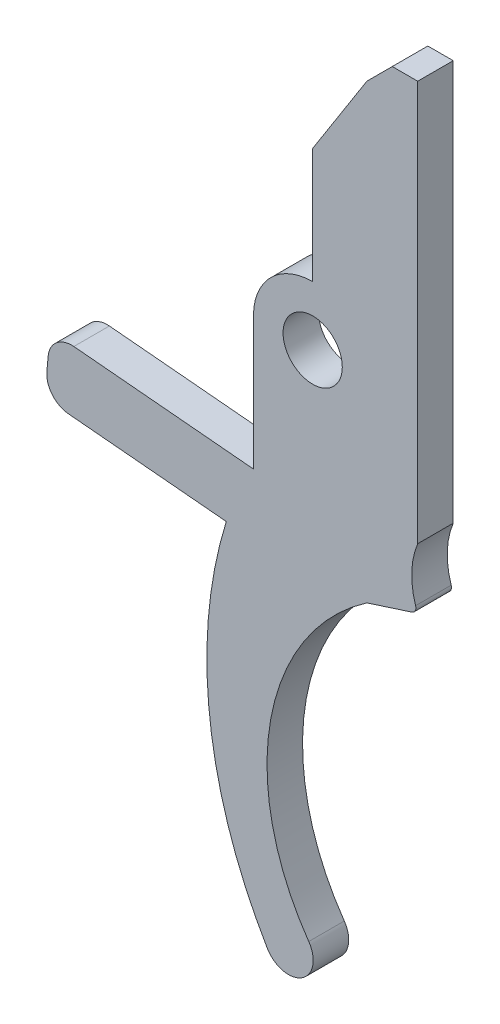
ISO-10303-21;
HEADER;
FILE_DESCRIPTION(('STEP AP214'),'2;1');
FILE_NAME('part.step','',(''),(''),'','','');
FILE_SCHEMA(('AUTOMOTIVE_DESIGN { 1 0 10303 214 1 1 1 1 }'));
ENDSEC;
DATA;
#1=APPLICATION_CONTEXT('core data for automotive mechanical design processes');
#2=APPLICATION_PROTOCOL_DEFINITION('international standard','automotive_design',2000,#1);
#3=PRODUCT_CONTEXT('',#1,'mechanical');
#4=PRODUCT('Part','Part','',(#3));
#5=PRODUCT_RELATED_PRODUCT_CATEGORY('part','',(#4));
#6=PRODUCT_DEFINITION_FORMATION('','',#4);
#7=PRODUCT_DEFINITION_CONTEXT('part definition',#1,'design');
#8=PRODUCT_DEFINITION('design','',#6,#7);
#9=PRODUCT_DEFINITION_SHAPE('','',#8);
#10=(LENGTH_UNIT() NAMED_UNIT(*) SI_UNIT(.MILLI.,.METRE.));
#11=(NAMED_UNIT(*) PLANE_ANGLE_UNIT() SI_UNIT($,.RADIAN.));
#12=(NAMED_UNIT(*) SI_UNIT($,.STERADIAN.) SOLID_ANGLE_UNIT());
#13=UNCERTAINTY_MEASURE_WITH_UNIT(LENGTH_MEASURE(1.E-05),#10,'distance_accuracy_value','');
#14=(GEOMETRIC_REPRESENTATION_CONTEXT(3) GLOBAL_UNCERTAINTY_ASSIGNED_CONTEXT((#13)) GLOBAL_UNIT_ASSIGNED_CONTEXT((#10,
#11,#12)) REPRESENTATION_CONTEXT('',''));
#15=CARTESIAN_POINT('',(0.,0.,0.));
#16=DIRECTION('',(0.,0.,1.));
#17=DIRECTION('',(1.,0.,0.));
#18=AXIS2_PLACEMENT_3D('',#15,#16,#17);
#19=CARTESIAN_POINT('',(8.86641034320296,0.,3.));
#20=DIRECTION('',(1.,0.,0.));
#21=DIRECTION('',(0.,1.,0.));
#22=AXIS2_PLACEMENT_3D('',#19,#20,#21);
#23=PLANE('',#22);
#24=DIRECTION('',(0.,-1.,0.));
#25=VECTOR('',#24,1.);
#26=CARTESIAN_POINT('',(8.86641034320296,0.,0.));
#27=LINE('',#26,#25);
#28=CARTESIAN_POINT('',(8.86641034320296,24.0890947898825,0.));
#29=VERTEX_POINT('',#28);
#30=CARTESIAN_POINT('',(8.86641034320296,-9.72823685462297,0.));
#31=VERTEX_POINT('',#30);
#32=EDGE_CURVE('E191',#29,#31,#27,.T.);
#33=ORIENTED_EDGE('',*,*,#32,.F.);
#34=DIRECTION('',(0.,0.,-1.));
#35=VECTOR('',#34,1.);
#36=CARTESIAN_POINT('',(8.86641034320296,24.0890947898825,3.));
#37=LINE('',#36,#35);
#38=CARTESIAN_POINT('',(8.86641034320296,24.0890947898825,3.));
#39=VERTEX_POINT('',#38);
#40=EDGE_CURVE('E11',#39,#29,#37,.T.);
#41=ORIENTED_EDGE('',*,*,#40,.F.);
#42=DIRECTION('',(0.,-1.,0.));
#43=VECTOR('',#42,1.);
#44=CARTESIAN_POINT('',(8.86641034320296,0.,3.));
#45=LINE('',#44,#43);
#46=CARTESIAN_POINT('',(8.86641034320296,-9.72823685462297,3.));
#47=VERTEX_POINT('',#46);
#48=EDGE_CURVE('E233',#39,#47,#45,.T.);
#49=ORIENTED_EDGE('',*,*,#48,.T.);
#50=DIRECTION('',(0.,0.,-1.));
#51=VECTOR('',#50,1.);
#52=CARTESIAN_POINT('',(8.86641034320296,-9.72823685462297,3.));
#53=LINE('',#52,#51);
#54=EDGE_CURVE('E51',#47,#31,#53,.T.);
#55=ORIENTED_EDGE('',*,*,#54,.T.);
#56=EDGE_LOOP('',(#33,#41,#49,#55));
#57=FACE_BOUND('',#56,.T.);
#58=ADVANCED_FACE('F35',(#57),#23,.T.);
#59=CARTESIAN_POINT('',(0.,24.0890947898825,3.));
#60=DIRECTION('',(0.,1.,0.));
#61=DIRECTION('',(0.,0.,1.));
#62=AXIS2_PLACEMENT_3D('',#59,#60,#61);
#63=PLANE('',#62);
#64=DIRECTION('',(1.,0.,0.));
#65=VECTOR('',#64,1.);
#66=CARTESIAN_POINT('',(0.,24.0890947898825,0.));
#67=LINE('',#66,#65);
#68=CARTESIAN_POINT('',(6.7207045833283,24.0890947898825,0.));
#69=VERTEX_POINT('',#68);
#70=EDGE_CURVE('E193',#69,#29,#67,.T.);
#71=ORIENTED_EDGE('',*,*,#70,.F.);
#72=DIRECTION('',(0.,0.,-1.));
#73=VECTOR('',#72,1.);
#74=CARTESIAN_POINT('',(6.7207045833283,24.0890947898825,3.));
#75=LINE('',#74,#73);
#76=CARTESIAN_POINT('',(6.7207045833283,24.0890947898825,3.));
#77=VERTEX_POINT('',#76);
#78=EDGE_CURVE('E43',#77,#69,#75,.T.);
#79=ORIENTED_EDGE('',*,*,#78,.F.);
#80=DIRECTION('',(1.,0.,0.));
#81=VECTOR('',#80,1.);
#82=CARTESIAN_POINT('',(0.,24.0890947898825,3.));
#83=LINE('',#82,#81);
#84=EDGE_CURVE('E287',#77,#39,#83,.T.);
#85=ORIENTED_EDGE('',*,*,#84,.T.);
#86=ORIENTED_EDGE('',*,*,#40,.T.);
#87=EDGE_LOOP('',(#71,#79,#85,#86));
#88=FACE_BOUND('',#87,.T.);
#89=ADVANCED_FACE('F286',(#88),#63,.T.);
#90=CARTESIAN_POINT('',(-8.68419510327712,8.68419510327721,3.));
#91=DIRECTION('',(0.707106781186544,-0.707106781186551,0.));
#92=DIRECTION('',(0.707106781186551,0.707106781186544,0.));
#93=AXIS2_PLACEMENT_3D('',#90,#91,#92);
#94=PLANE('',#93);
#95=DIRECTION('',(-0.707106781186551,-0.707106781186544,0.));
#96=VECTOR('',#95,1.);
#97=CARTESIAN_POINT('',(-8.68419510327712,8.68419510327721,0.));
#98=LINE('',#97,#96);
#99=CARTESIAN_POINT('',(4.57499882345365,21.9433890300078,0.));
#100=VERTEX_POINT('',#99);
#101=EDGE_CURVE('E196',#69,#100,#98,.T.);
#102=ORIENTED_EDGE('',*,*,#101,.T.);
#103=DIRECTION('',(0.,0.,-1.));
#104=VECTOR('',#103,1.);
#105=CARTESIAN_POINT('',(4.57499882345365,21.9433890300078,3.));
#106=LINE('',#105,#104);
#107=CARTESIAN_POINT('',(4.57499882345365,21.9433890300078,3.));
#108=VERTEX_POINT('',#107);
#109=EDGE_CURVE('E269',#108,#100,#106,.T.);
#110=ORIENTED_EDGE('',*,*,#109,.F.);
#111=DIRECTION('',(-0.707106781186551,-0.707106781186544,0.));
#112=VECTOR('',#111,1.);
#113=CARTESIAN_POINT('',(-8.68419510327712,8.68419510327721,3.));
#114=LINE('',#113,#112);
#115=EDGE_CURVE('E276',#77,#108,#114,.T.);
#116=ORIENTED_EDGE('',*,*,#115,.F.);
#117=ORIENTED_EDGE('',*,*,#78,.T.);
#118=EDGE_LOOP('',(#102,#110,#116,#117));
#119=FACE_BOUND('',#118,.T.);
#120=ADVANCED_FACE('F274',(#119),#94,.F.);
#121=CARTESIAN_POINT('',(-6.67347195424029,4.24029597773582,3.));
#122=DIRECTION('',(0.84403129205972,-0.53629392875922,0.));
#123=DIRECTION('',(0.53629392875922,0.84403129205972,0.));
#124=AXIS2_PLACEMENT_3D('',#121,#122,#123);
#125=PLANE('',#124);
#126=DIRECTION('',(-0.53629392875922,-0.84403129205972,0.));
#127=VECTOR('',#126,1.);
#128=CARTESIAN_POINT('',(-6.67347195424029,4.24029597773582,0.));
#129=LINE('',#128,#127);
#130=CARTESIAN_POINT('',(0.,14.7431543059915,0.));
#131=VERTEX_POINT('',#130);
#132=EDGE_CURVE('E198',#100,#131,#129,.T.);
#133=ORIENTED_EDGE('',*,*,#132,.T.);
#134=DIRECTION('',(0.,0.,-1.));
#135=VECTOR('',#134,1.);
#136=CARTESIAN_POINT('',(0.,14.7431543059915,3.));
#137=LINE('',#136,#135);
#138=CARTESIAN_POINT('',(0.,14.7431543059915,3.));
#139=VERTEX_POINT('',#138);
#140=EDGE_CURVE('E266',#139,#131,#137,.T.);
#141=ORIENTED_EDGE('',*,*,#140,.F.);
#142=DIRECTION('',(-0.53629392875922,-0.84403129205972,0.));
#143=VECTOR('',#142,1.);
#144=CARTESIAN_POINT('',(-6.67347195424029,4.24029597773582,3.));
#145=LINE('',#144,#143);
#146=EDGE_CURVE('E547',#108,#139,#145,.T.);
#147=ORIENTED_EDGE('',*,*,#146,.F.);
#148=ORIENTED_EDGE('',*,*,#109,.T.);
#149=EDGE_LOOP('',(#133,#141,#147,#148));
#150=FACE_BOUND('',#149,.T.);
#151=ADVANCED_FACE('F306',(#150),#125,.F.);
#152=CARTESIAN_POINT('',(0.,0.,3.));
#153=DIRECTION('',(1.,0.,0.));
#154=DIRECTION('',(0.,0.,-1.));
#155=AXIS2_PLACEMENT_3D('',#152,#153,#154);
#156=PLANE('',#155);
#157=DIRECTION('',(0.,-1.,0.));
#158=VECTOR('',#157,1.);
#159=CARTESIAN_POINT('',(0.,0.,0.));
#160=LINE('',#159,#158);
#161=CARTESIAN_POINT('',(0.,5.,0.));
#162=VERTEX_POINT('',#161);
#163=EDGE_CURVE('E200',#131,#162,#160,.T.);
#164=ORIENTED_EDGE('',*,*,#163,.T.);
#165=DIRECTION('',(0.,0.,-1.));
#166=VECTOR('',#165,1.);
#167=CARTESIAN_POINT('',(0.,5.,3.));
#168=LINE('',#167,#166);
#169=CARTESIAN_POINT('',(0.,5.,3.));
#170=VERTEX_POINT('',#169);
#171=EDGE_CURVE('E263',#170,#162,#168,.T.);
#172=ORIENTED_EDGE('',*,*,#171,.F.);
#173=DIRECTION('',(0.,-1.,0.));
#174=VECTOR('',#173,1.);
#175=CARTESIAN_POINT('',(0.,0.,3.));
#176=LINE('',#175,#174);
#177=EDGE_CURVE('E545',#139,#170,#176,.T.);
#178=ORIENTED_EDGE('',*,*,#177,.F.);
#179=ORIENTED_EDGE('',*,*,#140,.T.);
#180=EDGE_LOOP('',(#164,#172,#178,#179));
#181=FACE_BOUND('',#180,.T.);
#182=ADVANCED_FACE('F311',(#181),#156,.F.);
#183=CARTESIAN_POINT('',(0.,0.,3.));
#184=DIRECTION('',(0.,0.,-1.));
#185=DIRECTION('',(-1.,0.,0.));
#186=AXIS2_PLACEMENT_3D('',#183,#184,#185);
#187=CYLINDRICAL_SURFACE('',#186,5.);
#188=CARTESIAN_POINT('',(0.,0.,0.));
#189=DIRECTION('',(0.,0.,1.));
#190=DIRECTION('',(1.,0.,0.));
#191=AXIS2_PLACEMENT_3D('',#188,#189,#190);
#192=CIRCLE('',#191,5.);
#193=CARTESIAN_POINT('',(-5.,0.,0.));
#194=VERTEX_POINT('',#193);
#195=EDGE_CURVE('E202',#162,#194,#192,.T.);
#196=ORIENTED_EDGE('',*,*,#195,.T.);
#197=DIRECTION('',(0.,0.,-1.));
#198=VECTOR('',#197,1.);
#199=CARTESIAN_POINT('',(-5.,0.,3.));
#200=LINE('',#199,#198);
#201=CARTESIAN_POINT('',(-5.,0.,3.));
#202=VERTEX_POINT('',#201);
#203=EDGE_CURVE('E260',#202,#194,#200,.T.);
#204=ORIENTED_EDGE('',*,*,#203,.F.);
#205=CARTESIAN_POINT('',(0.,0.,3.));
#206=DIRECTION('',(0.,0.,1.));
#207=DIRECTION('',(1.,0.,0.));
#208=AXIS2_PLACEMENT_3D('',#205,#206,#207);
#209=CIRCLE('',#208,5.);
#210=EDGE_CURVE('E541',#170,#202,#209,.T.);
#211=ORIENTED_EDGE('',*,*,#210,.F.);
#212=ORIENTED_EDGE('',*,*,#171,.T.);
#213=EDGE_LOOP('',(#196,#204,#211,#212));
#214=FACE_BOUND('',#213,.T.);
#215=ADVANCED_FACE('F315',(#214),#187,.T.);
#216=CARTESIAN_POINT('',(-5.,0.,3.));
#217=DIRECTION('',(1.,0.,0.));
#218=DIRECTION('',(0.,0.,-1.));
#219=AXIS2_PLACEMENT_3D('',#216,#217,#218);
#220=PLANE('',#219);
#221=DIRECTION('',(0.,-1.,0.));
#222=VECTOR('',#221,1.);
#223=CARTESIAN_POINT('',(-5.,0.,0.));
#224=LINE('',#223,#222);
#225=CARTESIAN_POINT('',(-5.,-11.2022730729682,0.));
#226=VERTEX_POINT('',#225);
#227=EDGE_CURVE('E204',#194,#226,#224,.T.);
#228=ORIENTED_EDGE('',*,*,#227,.T.);
#229=DIRECTION('',(0.,0.,-1.));
#230=VECTOR('',#229,1.);
#231=CARTESIAN_POINT('',(-5.,-11.2022730729682,3.));
#232=LINE('',#231,#230);
#233=CARTESIAN_POINT('',(-5.,-11.2022730729682,3.));
#234=VERTEX_POINT('',#233);
#235=EDGE_CURVE('E257',#234,#226,#232,.T.);
#236=ORIENTED_EDGE('',*,*,#235,.F.);
#237=DIRECTION('',(0.,-1.,0.));
#238=VECTOR('',#237,1.);
#239=CARTESIAN_POINT('',(-5.,0.,3.));
#240=LINE('',#239,#238);
#241=EDGE_CURVE('E538',#202,#234,#240,.T.);
#242=ORIENTED_EDGE('',*,*,#241,.F.);
#243=ORIENTED_EDGE('',*,*,#203,.T.);
#244=EDGE_LOOP('',(#228,#236,#242,#243));
#245=FACE_BOUND('',#244,.T.);
#246=ADVANCED_FACE('F319',(#245),#220,.F.);
#247=CARTESIAN_POINT('',(-1.05178514284933,-11.5614556745727,3.));
#248=DIRECTION('',(-0.0905992835595561,-0.995887428286197,0.));
#249=DIRECTION('',(0.995887428286197,-0.0905992835595561,0.));
#250=AXIS2_PLACEMENT_3D('',#247,#248,#249);
#251=PLANE('',#250);
#252=DIRECTION('',(-0.995887428286197,0.0905992835595561,0.));
#253=VECTOR('',#252,1.);
#254=CARTESIAN_POINT('',(-1.05178514284933,-11.5614556745727,0.));
#255=LINE('',#254,#253);
#256=CARTESIAN_POINT('',(-20.1624606171726,-9.82289220129703,0.));
#257=VERTEX_POINT('',#256);
#258=EDGE_CURVE('E206',#226,#257,#255,.T.);
#259=ORIENTED_EDGE('',*,*,#258,.T.);
#260=DIRECTION('',(0.,0.,-1.));
#261=VECTOR('',#260,1.);
#262=CARTESIAN_POINT('',(-20.1624606171726,-9.82289220129703,3.));
#263=LINE('',#262,#261);
#264=CARTESIAN_POINT('',(-20.1624606171726,-9.82289220129703,3.));
#265=VERTEX_POINT('',#264);
#266=EDGE_CURVE('E254',#265,#257,#263,.T.);
#267=ORIENTED_EDGE('',*,*,#266,.F.);
#268=DIRECTION('',(-0.995887428286197,0.0905992835595561,0.));
#269=VECTOR('',#268,1.);
#270=CARTESIAN_POINT('',(-1.05178514284933,-11.5614556745727,3.));
#271=LINE('',#270,#269);
#272=EDGE_CURVE('E536',#234,#265,#271,.T.);
#273=ORIENTED_EDGE('',*,*,#272,.F.);
#274=ORIENTED_EDGE('',*,*,#235,.T.);
#275=EDGE_LOOP('',(#259,#267,#273,#274));
#276=FACE_BOUND('',#275,.T.);
#277=ADVANCED_FACE('F323',(#276),#251,.F.);
#278=CARTESIAN_POINT('',(-20.3436591842917,-11.8146670578694,3.));
#279=DIRECTION('',(0.,0.,-1.));
#280=DIRECTION('',(-1.,0.,0.));
#281=AXIS2_PLACEMENT_3D('',#278,#279,#280);
#282=CYLINDRICAL_SURFACE('',#281,2.);
#283=CARTESIAN_POINT('',(-20.3436591842917,-11.8146670578694,0.));
#284=DIRECTION('',(0.,0.,1.));
#285=DIRECTION('',(1.,0.,0.));
#286=AXIS2_PLACEMENT_3D('',#283,#284,#285);
#287=CIRCLE('',#286,2.);
#288=CARTESIAN_POINT('',(-22.3354340408641,-11.6334684907503,0.));
#289=VERTEX_POINT('',#288);
#290=EDGE_CURVE('E208',#257,#289,#287,.T.);
#291=ORIENTED_EDGE('',*,*,#290,.T.);
#292=DIRECTION('',(0.,0.,-1.));
#293=VECTOR('',#292,1.);
#294=CARTESIAN_POINT('',(-22.3354340408641,-11.6334684907503,3.));
#295=LINE('',#294,#293);
#296=CARTESIAN_POINT('',(-22.3354340408641,-11.6334684907503,3.));
#297=VERTEX_POINT('',#296);
#298=EDGE_CURVE('E251',#297,#289,#295,.T.);
#299=ORIENTED_EDGE('',*,*,#298,.F.);
#300=CARTESIAN_POINT('',(-20.3436591842917,-11.8146670578694,3.));
#301=DIRECTION('',(0.,0.,1.));
#302=DIRECTION('',(1.,0.,0.));
#303=AXIS2_PLACEMENT_3D('',#300,#301,#302);
#304=CIRCLE('',#303,2.);
#305=EDGE_CURVE('E529',#265,#297,#304,.T.);
#306=ORIENTED_EDGE('',*,*,#305,.F.);
#307=ORIENTED_EDGE('',*,*,#266,.T.);
#308=EDGE_LOOP('',(#291,#299,#306,#307));
#309=FACE_BOUND('',#308,.T.);
#310=ADVANCED_FACE('F327',(#309),#282,.T.);
#311=CARTESIAN_POINT('',(-21.1024503308957,1.91976204039482,3.));
#312=DIRECTION('',(0.995887428286197,-0.0905992835595558,0.));
#313=DIRECTION('',(0.0905992835595558,0.995887428286197,0.));
#314=AXIS2_PLACEMENT_3D('',#311,#312,#313);
#315=PLANE('',#314);
#316=DIRECTION('',(-0.0905992835595558,-0.995887428286197,0.));
#317=VECTOR('',#316,1.);
#318=CARTESIAN_POINT('',(-21.1024503308957,1.91976204039482,0.));
#319=LINE('',#318,#317);
#320=CARTESIAN_POINT('',(-22.4416911387046,-12.8014700879813,0.));
#321=VERTEX_POINT('',#320);
#322=EDGE_CURVE('E210',#289,#321,#319,.T.);
#323=ORIENTED_EDGE('',*,*,#322,.T.);
#324=DIRECTION('',(0.,0.,-1.));
#325=VECTOR('',#324,1.);
#326=CARTESIAN_POINT('',(-22.4416911387046,-12.8014700879813,3.));
#327=LINE('',#326,#325);
#328=CARTESIAN_POINT('',(-22.4416911387046,-12.8014700879813,3.));
#329=VERTEX_POINT('',#328);
#330=EDGE_CURVE('E248',#329,#321,#327,.T.);
#331=ORIENTED_EDGE('',*,*,#330,.F.);
#332=DIRECTION('',(-0.0905992835595558,-0.995887428286197,0.));
#333=VECTOR('',#332,1.);
#334=CARTESIAN_POINT('',(-21.1024503308957,1.91976204039482,3.));
#335=LINE('',#334,#333);
#336=EDGE_CURVE('E526',#297,#329,#335,.T.);
#337=ORIENTED_EDGE('',*,*,#336,.F.);
#338=ORIENTED_EDGE('',*,*,#298,.T.);
#339=EDGE_LOOP('',(#323,#331,#337,#338));
#340=FACE_BOUND('',#339,.T.);
#341=ADVANCED_FACE('F331',(#340),#315,.F.);
#342=CARTESIAN_POINT('',(-20.4499162821322,-12.9826686551004,3.));
#343=DIRECTION('',(0.,0.,-1.));
#344=DIRECTION('',(-1.,0.,0.));
#345=AXIS2_PLACEMENT_3D('',#342,#343,#344);
#346=CYLINDRICAL_SURFACE('',#345,2.);
#347=CARTESIAN_POINT('',(-20.4499162821322,-12.9826686551004,0.));
#348=DIRECTION('',(0.,0.,1.));
#349=DIRECTION('',(1.,0.,0.));
#350=AXIS2_PLACEMENT_3D('',#347,#348,#349);
#351=CIRCLE('',#350,2.);
#352=CARTESIAN_POINT('',(-20.6311148492513,-14.9744435116728,0.));
#353=VERTEX_POINT('',#352);
#354=EDGE_CURVE('E212',#321,#353,#351,.T.);
#355=ORIENTED_EDGE('',*,*,#354,.T.);
#356=DIRECTION('',(0.,0.,-1.));
#357=VECTOR('',#356,1.);
#358=CARTESIAN_POINT('',(-20.6311148492513,-14.9744435116728,3.));
#359=LINE('',#358,#357);
#360=CARTESIAN_POINT('',(-20.6311148492513,-14.9744435116728,3.));
#361=VERTEX_POINT('',#360);
#362=EDGE_CURVE('E245',#361,#353,#359,.T.);
#363=ORIENTED_EDGE('',*,*,#362,.F.);
#364=CARTESIAN_POINT('',(-20.4499162821322,-12.9826686551004,3.));
#365=DIRECTION('',(0.,0.,1.));
#366=DIRECTION('',(1.,0.,0.));
#367=AXIS2_PLACEMENT_3D('',#364,#365,#366);
#368=CIRCLE('',#367,2.);
#369=EDGE_CURVE('E524',#329,#361,#368,.T.);
#370=ORIENTED_EDGE('',*,*,#369,.F.);
#371=ORIENTED_EDGE('',*,*,#330,.T.);
#372=EDGE_LOOP('',(#355,#363,#370,#371));
#373=FACE_BOUND('',#372,.T.);
#374=ADVANCED_FACE('F335',(#373),#346,.T.);
#375=CARTESIAN_POINT('',(-1.52043937492807,-16.7130069849485,3.));
#376=DIRECTION('',(0.0905992835595559,0.995887428286197,0.));
#377=DIRECTION('',(-0.995887428286197,0.090599283559556,0.));
#378=AXIS2_PLACEMENT_3D('',#375,#376,#377);
#379=PLANE('',#378);
#380=DIRECTION('',(0.995887428286197,-0.0905992835595559,0.));
#381=VECTOR('',#380,1.);
#382=CARTESIAN_POINT('',(-1.52043937492807,-16.7130069849485,0.));
#383=LINE('',#382,#381);
#384=CARTESIAN_POINT('',(-7.29313308515625,-16.1878453055251,0.));
#385=VERTEX_POINT('',#384);
#386=EDGE_CURVE('E214',#353,#385,#383,.T.);
#387=ORIENTED_EDGE('',*,*,#386,.T.);
#388=DIRECTION('',(0.,0.,-1.));
#389=VECTOR('',#388,1.);
#390=CARTESIAN_POINT('',(-7.29313308515625,-16.1878453055251,3.));
#391=LINE('',#390,#389);
#392=CARTESIAN_POINT('',(-7.29313308515625,-16.1878453055251,3.));
#393=VERTEX_POINT('',#392);
#394=EDGE_CURVE('E242',#393,#385,#391,.T.);
#395=ORIENTED_EDGE('',*,*,#394,.F.);
#396=DIRECTION('',(0.995887428286197,-0.0905992835595559,0.));
#397=VECTOR('',#396,1.);
#398=CARTESIAN_POINT('',(-1.52043937492807,-16.7130069849485,3.));
#399=LINE('',#398,#397);
#400=EDGE_CURVE('E517',#361,#393,#399,.T.);
#401=ORIENTED_EDGE('',*,*,#400,.F.);
#402=ORIENTED_EDGE('',*,*,#362,.T.);
#403=EDGE_LOOP('',(#387,#395,#401,#402));
#404=FACE_BOUND('',#403,.T.);
#405=ADVANCED_FACE('F339',(#404),#379,.F.);
#406=CARTESIAN_POINT('',(27.6461324361651,-27.0197476463683,3.));
#407=DIRECTION('',(0.,0.,-1.));
#408=DIRECTION('',(-1.,0.,0.));
#409=AXIS2_PLACEMENT_3D('',#406,#407,#408);
#410=CYLINDRICAL_SURFACE('',#409,36.579808412442);
#411=CARTESIAN_POINT('',(27.6461324361651,-27.0197476463683,0.));
#412=DIRECTION('',(0.,0.,1.));
#413=DIRECTION('',(1.,0.,0.));
#414=AXIS2_PLACEMENT_3D('',#411,#412,#413);
#415=CIRCLE('',#414,36.579808412442);
#416=CARTESIAN_POINT('',(-3.82416955630793,-45.6665295669441,0.));
#417=VERTEX_POINT('',#416);
#418=EDGE_CURVE('E216',#385,#417,#415,.T.);
#419=ORIENTED_EDGE('',*,*,#418,.T.);
#420=DIRECTION('',(0.,0.,-1.));
#421=VECTOR('',#420,1.);
#422=CARTESIAN_POINT('',(-3.82416955630793,-45.6665295669441,3.));
#423=LINE('',#422,#421);
#424=CARTESIAN_POINT('',(-3.82416955630793,-45.6665295669441,3.));
#425=VERTEX_POINT('',#424);
#426=EDGE_CURVE('E239',#425,#417,#423,.T.);
#427=ORIENTED_EDGE('',*,*,#426,.F.);
#428=CARTESIAN_POINT('',(27.6461324361651,-27.0197476463683,3.));
#429=DIRECTION('',(0.,0.,1.));
#430=DIRECTION('',(1.,0.,0.));
#431=AXIS2_PLACEMENT_3D('',#428,#429,#430);
#432=CIRCLE('',#431,36.579808412442);
#433=EDGE_CURVE('E514',#393,#425,#432,.T.);
#434=ORIENTED_EDGE('',*,*,#433,.F.);
#435=ORIENTED_EDGE('',*,*,#394,.T.);
#436=EDGE_LOOP('',(#419,#427,#434,#435));
#437=FACE_BOUND('',#436,.T.);
#438=ADVANCED_FACE('F343',(#437),#410,.T.);
#439=CARTESIAN_POINT('',(-2.03451103776856,-44.6061211820648,3.));
#440=DIRECTION('',(0.,0.,-1.));
#441=DIRECTION('',(-1.,0.,0.));
#442=AXIS2_PLACEMENT_3D('',#439,#440,#441);
#443=CYLINDRICAL_SURFACE('',#442,2.0802268039093);
#444=CARTESIAN_POINT('',(-2.03451103776856,-44.6061211820648,0.));
#445=DIRECTION('',(0.,0.,1.));
#446=DIRECTION('',(1.,0.,0.));
#447=AXIS2_PLACEMENT_3D('',#444,#445,#446);
#448=CIRCLE('',#447,2.0802268039093);
#449=CARTESIAN_POINT('',(-0.330957040162425,-43.4122839515586,0.));
#450=VERTEX_POINT('',#449);
#451=EDGE_CURVE('E218',#417,#450,#448,.T.);
#452=ORIENTED_EDGE('',*,*,#451,.T.);
#453=DIRECTION('',(0.,0.,-1.));
#454=VECTOR('',#453,1.);
#455=CARTESIAN_POINT('',(-0.330957040162425,-43.4122839515586,3.));
#456=LINE('',#455,#454);
#457=CARTESIAN_POINT('',(-0.330957040162425,-43.4122839515586,3.));
#458=VERTEX_POINT('',#457);
#459=EDGE_CURVE('E237',#458,#450,#456,.T.);
#460=ORIENTED_EDGE('',*,*,#459,.F.);
#461=CARTESIAN_POINT('',(-2.03451103776856,-44.6061211820648,3.));
#462=DIRECTION('',(0.,0.,1.));
#463=DIRECTION('',(1.,0.,0.));
#464=AXIS2_PLACEMENT_3D('',#461,#462,#463);
#465=CIRCLE('',#464,2.0802268039093);
#466=EDGE_CURVE('E512',#425,#458,#465,.T.);
#467=ORIENTED_EDGE('',*,*,#466,.F.);
#468=ORIENTED_EDGE('',*,*,#426,.T.);
#469=EDGE_LOOP('',(#452,#460,#467,#468));
#470=FACE_BOUND('',#469,.T.);
#471=ADVANCED_FACE('F347',(#470),#443,.T.);
#472=CARTESIAN_POINT('',(15.6129504046658,-32.2389191306449,3.));
#473=DIRECTION('',(0.,0.,-1.));
#474=DIRECTION('',(-1.,0.,0.));
#475=AXIS2_PLACEMENT_3D('',#472,#473,#474);
#476=CYLINDRICAL_SURFACE('',#475,19.4692646504813);
#477=CARTESIAN_POINT('',(15.6129504046658,-32.2389191306449,0.));
#478=DIRECTION('',(0.,0.,1.));
#479=DIRECTION('',(1.,0.,0.));
#480=AXIS2_PLACEMENT_3D('',#477,#478,#479);
#481=CIRCLE('',#480,19.4692646504813);
#482=CARTESIAN_POINT('',(4.57499882345365,-16.200967549433,0.));
#483=VERTEX_POINT('',#482);
#484=EDGE_CURVE('E221',#483,#450,#481,.T.);
#485=ORIENTED_EDGE('',*,*,#484,.F.);
#486=DIRECTION('',(0.,0.,-1.));
#487=VECTOR('',#486,1.);
#488=CARTESIAN_POINT('',(4.57499882345365,-16.200967549433,3.));
#489=LINE('',#488,#487);
#490=CARTESIAN_POINT('',(4.57499882345365,-16.200967549433,3.));
#491=VERTEX_POINT('',#490);
#492=EDGE_CURVE('E170',#491,#483,#489,.T.);
#493=ORIENTED_EDGE('',*,*,#492,.F.);
#494=CARTESIAN_POINT('',(15.6129504046658,-32.2389191306449,3.));
#495=DIRECTION('',(0.,0.,1.));
#496=DIRECTION('',(1.,0.,0.));
#497=AXIS2_PLACEMENT_3D('',#494,#495,#496);
#498=CIRCLE('',#497,19.4692646504813);
#499=EDGE_CURVE('E180',#491,#458,#498,.T.);
#500=ORIENTED_EDGE('',*,*,#499,.T.);
#501=ORIENTED_EDGE('',*,*,#459,.T.);
#502=EDGE_LOOP('',(#485,#493,#500,#501));
#503=FACE_BOUND('',#502,.T.);
#504=ADVANCED_FACE('F351',(#503),#476,.F.);
#505=CARTESIAN_POINT('',(5.15933304521913,-16.0126934865883,3.));
#506=DIRECTION('',(0.306676932046085,-0.95181366839881,0.));
#507=DIRECTION('',(0.951813668398811,0.306676932046085,0.));
#508=AXIS2_PLACEMENT_3D('',#505,#506,#507);
#509=PLANE('',#508);
#510=DIRECTION('',(-0.951813668398811,-0.306676932046085,0.));
#511=VECTOR('',#510,1.);
#512=CARTESIAN_POINT('',(5.15933304521913,-16.0126934865883,0.));
#513=LINE('',#512,#511);
#514=CARTESIAN_POINT('',(8.37011859951791,-14.9781697179743,0.));
#515=VERTEX_POINT('',#514);
#516=EDGE_CURVE('E166',#515,#483,#513,.T.);
#517=ORIENTED_EDGE('',*,*,#516,.F.);
#518=DIRECTION('',(0.,0.,-1.));
#519=VECTOR('',#518,1.);
#520=CARTESIAN_POINT('',(8.37011859951791,-14.9781697179743,3.));
#521=LINE('',#520,#519);
#522=CARTESIAN_POINT('',(8.37011859951791,-14.9781697179743,3.));
#523=VERTEX_POINT('',#522);
#524=EDGE_CURVE('E161',#523,#515,#521,.T.);
#525=ORIENTED_EDGE('',*,*,#524,.F.);
#526=DIRECTION('',(-0.951813668398811,-0.306676932046085,0.));
#527=VECTOR('',#526,1.);
#528=CARTESIAN_POINT('',(5.15933304521913,-16.0126934865883,3.));
#529=LINE('',#528,#527);
#530=EDGE_CURVE('E164',#523,#491,#529,.T.);
#531=ORIENTED_EDGE('',*,*,#530,.T.);
#532=ORIENTED_EDGE('',*,*,#492,.T.);
#533=EDGE_LOOP('',(#517,#525,#531,#532));
#534=FACE_BOUND('',#533,.T.);
#535=ADVANCED_FACE('F163',(#534),#509,.T.);
#536=CARTESIAN_POINT('',(8.21678013349487,-14.5022628837749,3.));
#537=DIRECTION('',(0.,0.,-1.));
#538=DIRECTION('',(-1.,0.,0.));
#539=AXIS2_PLACEMENT_3D('',#536,#537,#538);
#540=CYLINDRICAL_SURFACE('',#539,0.499999999999999);
#541=CARTESIAN_POINT('',(8.21678013349487,-14.5022628837749,0.));
#542=DIRECTION('',(0.,0.,1.));
#543=DIRECTION('',(1.,0.,0.));
#544=AXIS2_PLACEMENT_3D('',#541,#542,#543);
#545=CIRCLE('',#544,0.499999999999999);
#546=CARTESIAN_POINT('',(8.69193724020569,-14.3466167339921,0.));
#547=VERTEX_POINT('',#546);
#548=EDGE_CURVE('E225',#547,#515,#545,.F.);
#549=ORIENTED_EDGE('',*,*,#548,.F.);
#550=DIRECTION('',(0.,0.,-1.));
#551=VECTOR('',#550,1.);
#552=CARTESIAN_POINT('',(8.69193724020569,-14.3466167339921,3.));
#553=LINE('',#552,#551);
#554=CARTESIAN_POINT('',(8.69193724020569,-14.3466167339921,3.));
#555=VERTEX_POINT('',#554);
#556=EDGE_CURVE('E106',#555,#547,#553,.T.);
#557=ORIENTED_EDGE('',*,*,#556,.F.);
#558=CARTESIAN_POINT('',(8.21678013349487,-14.5022628837749,3.));
#559=DIRECTION('',(0.,0.,1.));
#560=DIRECTION('',(1.,0.,0.));
#561=AXIS2_PLACEMENT_3D('',#558,#559,#560);
#562=CIRCLE('',#561,0.499999999999999);
#563=EDGE_CURVE('E178',#555,#523,#562,.F.);
#564=ORIENTED_EDGE('',*,*,#563,.T.);
#565=ORIENTED_EDGE('',*,*,#524,.T.);
#566=EDGE_LOOP('',(#549,#557,#564,#565));
#567=FACE_BOUND('',#566,.T.);
#568=ADVANCED_FACE('F182',(#567),#540,.T.);
#569=CARTESIAN_POINT('',(15.0215183563078,-12.2732500168687,3.));
#570=DIRECTION('',(0.,0.,-1.));
#571=DIRECTION('',(-1.,0.,0.));
#572=AXIS2_PLACEMENT_3D('',#569,#570,#571);
#573=CYLINDRICAL_SURFACE('',#572,6.66051399285304);
#574=CARTESIAN_POINT('',(15.0215183563078,-12.2732500168687,0.));
#575=DIRECTION('',(0.,0.,1.));
#576=DIRECTION('',(1.,0.,0.));
#577=AXIS2_PLACEMENT_3D('',#574,#575,#576);
#578=CIRCLE('',#577,6.66051399285304);
#579=EDGE_CURVE('E227',#31,#547,#578,.T.);
#580=ORIENTED_EDGE('',*,*,#579,.F.);
#581=ORIENTED_EDGE('',*,*,#54,.F.);
#582=CARTESIAN_POINT('',(15.0215183563078,-12.2732500168687,3.));
#583=DIRECTION('',(0.,0.,1.));
#584=DIRECTION('',(1.,0.,0.));
#585=AXIS2_PLACEMENT_3D('',#582,#583,#584);
#586=CIRCLE('',#585,6.66051399285304);
#587=EDGE_CURVE('E183',#47,#555,#586,.T.);
#588=ORIENTED_EDGE('',*,*,#587,.T.);
#589=ORIENTED_EDGE('',*,*,#556,.T.);
#590=EDGE_LOOP('',(#580,#581,#588,#589));
#591=FACE_BOUND('',#590,.T.);
#592=ADVANCED_FACE('F288',(#591),#573,.F.);
#593=CARTESIAN_POINT('',(0.,0.,3.));
#594=DIRECTION('',(0.,0.,-1.));
#595=DIRECTION('',(-1.,0.,0.));
#596=AXIS2_PLACEMENT_3D('',#593,#594,#595);
#597=CYLINDRICAL_SURFACE('',#596,2.5);
#598=CARTESIAN_POINT('',(0.,0.,3.));
#599=DIRECTION('',(0.,0.,1.));
#600=DIRECTION('',(1.,0.,0.));
#601=AXIS2_PLACEMENT_3D('',#598,#599,#600);
#602=CIRCLE('',#601,2.5);
#603=CARTESIAN_POINT('',(2.5,0.,3.));
#604=VERTEX_POINT('',#603);
#605=EDGE_CURVE('E185',#604,#604,#602,.T.);
#606=ORIENTED_EDGE('',*,*,#605,.T.);
#607=EDGE_LOOP('',(#606));
#608=FACE_BOUND('',#607,.T.);
#609=CARTESIAN_POINT('',(0.,0.,0.));
#610=DIRECTION('',(0.,0.,1.));
#611=DIRECTION('',(1.,0.,0.));
#612=AXIS2_PLACEMENT_3D('',#609,#610,#611);
#613=CIRCLE('',#612,2.5);
#614=CARTESIAN_POINT('',(2.5,0.,0.));
#615=VERTEX_POINT('',#614);
#616=EDGE_CURVE('E230',#615,#615,#613,.T.);
#617=ORIENTED_EDGE('',*,*,#616,.F.);
#618=EDGE_LOOP('',(#617));
#619=FACE_BOUND('',#618,.T.);
#620=ADVANCED_FACE('F290',(#608,#619),#597,.F.);
#621=CARTESIAN_POINT('',(0.,0.,3.));
#622=DIRECTION('',(0.,0.,1.));
#623=DIRECTION('',(1.,0.,0.));
#624=AXIS2_PLACEMENT_3D('',#621,#622,#623);
#625=PLANE('',#624);
#626=ORIENTED_EDGE('',*,*,#48,.F.);
#627=ORIENTED_EDGE('',*,*,#84,.F.);
#628=ORIENTED_EDGE('',*,*,#115,.T.);
#629=ORIENTED_EDGE('',*,*,#146,.T.);
#630=ORIENTED_EDGE('',*,*,#177,.T.);
#631=ORIENTED_EDGE('',*,*,#210,.T.);
#632=ORIENTED_EDGE('',*,*,#241,.T.);
#633=ORIENTED_EDGE('',*,*,#272,.T.);
#634=ORIENTED_EDGE('',*,*,#305,.T.);
#635=ORIENTED_EDGE('',*,*,#336,.T.);
#636=ORIENTED_EDGE('',*,*,#369,.T.);
#637=ORIENTED_EDGE('',*,*,#400,.T.);
#638=ORIENTED_EDGE('',*,*,#433,.T.);
#639=ORIENTED_EDGE('',*,*,#466,.T.);
#640=ORIENTED_EDGE('',*,*,#499,.F.);
#641=ORIENTED_EDGE('',*,*,#530,.F.);
#642=ORIENTED_EDGE('',*,*,#563,.F.);
#643=ORIENTED_EDGE('',*,*,#587,.F.);
#644=EDGE_LOOP('',(#626,#627,#628,#629,#630,#631,#632,#633,#634,#635,#636,#637,#638,#639,#640,
#641,#642,#643));
#645=FACE_BOUND('',#644,.T.);
#646=ORIENTED_EDGE('',*,*,#605,.F.);
#647=EDGE_LOOP('',(#646));
#648=FACE_BOUND('',#647,.T.);
#649=ADVANCED_FACE('F175',(#645,#648),#625,.T.);
#650=CARTESIAN_POINT('',(0.,0.,0.));
#651=DIRECTION('',(0.,0.,1.));
#652=DIRECTION('',(1.,0.,0.));
#653=AXIS2_PLACEMENT_3D('',#650,#651,#652);
#654=PLANE('',#653);
#655=ORIENTED_EDGE('',*,*,#32,.T.);
#656=ORIENTED_EDGE('',*,*,#579,.T.);
#657=ORIENTED_EDGE('',*,*,#548,.T.);
#658=ORIENTED_EDGE('',*,*,#516,.T.);
#659=ORIENTED_EDGE('',*,*,#484,.T.);
#660=ORIENTED_EDGE('',*,*,#451,.F.);
#661=ORIENTED_EDGE('',*,*,#418,.F.);
#662=ORIENTED_EDGE('',*,*,#386,.F.);
#663=ORIENTED_EDGE('',*,*,#354,.F.);
#664=ORIENTED_EDGE('',*,*,#322,.F.);
#665=ORIENTED_EDGE('',*,*,#290,.F.);
#666=ORIENTED_EDGE('',*,*,#258,.F.);
#667=ORIENTED_EDGE('',*,*,#227,.F.);
#668=ORIENTED_EDGE('',*,*,#195,.F.);
#669=ORIENTED_EDGE('',*,*,#163,.F.);
#670=ORIENTED_EDGE('',*,*,#132,.F.);
#671=ORIENTED_EDGE('',*,*,#101,.F.);
#672=ORIENTED_EDGE('',*,*,#70,.T.);
#673=EDGE_LOOP('',(#655,#656,#657,#658,#659,#660,#661,#662,#663,#664,#665,#666,#667,#668,#669,
#670,#671,#672));
#674=FACE_BOUND('',#673,.T.);
#675=ORIENTED_EDGE('',*,*,#616,.T.);
#676=EDGE_LOOP('',(#675));
#677=FACE_BOUND('',#676,.T.);
#678=ADVANCED_FACE('F283',(#674,#677),#654,.F.);
#679=CLOSED_SHELL('',(#58,#89,#120,#151,#182,#215,#246,#277,#310,#341,#374,#405,#438,#471,#504,
#535,#568,#592,#620,#649,#678));
#680=MANIFOLD_SOLID_BREP('B2',#679);
#681=ADVANCED_BREP_SHAPE_REPRESENTATION('',(#18,#680),#14);
#682=SHAPE_DEFINITION_REPRESENTATION(#9,#681);
ENDSEC;
END-ISO-10303-21;
